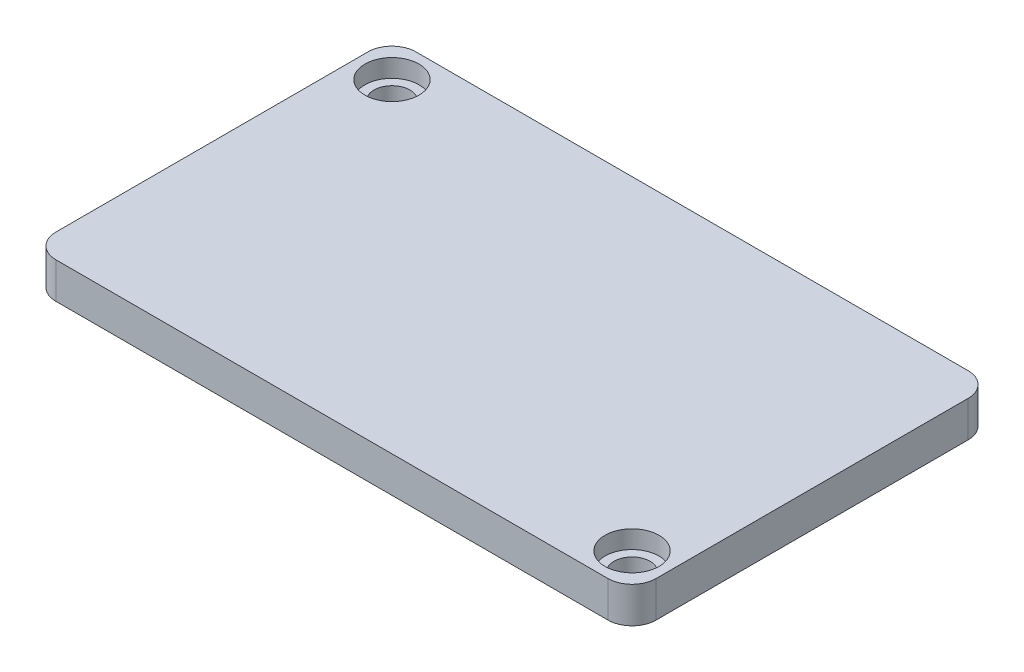
ISO-10303-21;
HEADER;
FILE_DESCRIPTION(('STEP AP214'),'2;1');
FILE_NAME('part.step','',(''),(''),'','','');
FILE_SCHEMA(('AUTOMOTIVE_DESIGN { 1 0 10303 214 1 1 1 1 }'));
ENDSEC;
DATA;
#1=APPLICATION_CONTEXT('core data for automotive mechanical design processes');
#2=APPLICATION_PROTOCOL_DEFINITION('international standard','automotive_design',2000,#1);
#3=PRODUCT_CONTEXT('',#1,'mechanical');
#4=PRODUCT('Part','Part','',(#3));
#5=PRODUCT_RELATED_PRODUCT_CATEGORY('part','',(#4));
#6=PRODUCT_DEFINITION_FORMATION('','',#4);
#7=PRODUCT_DEFINITION_CONTEXT('part definition',#1,'design');
#8=PRODUCT_DEFINITION('design','',#6,#7);
#9=PRODUCT_DEFINITION_SHAPE('','',#8);
#10=(LENGTH_UNIT() NAMED_UNIT(*) SI_UNIT(.MILLI.,.METRE.));
#11=(NAMED_UNIT(*) PLANE_ANGLE_UNIT() SI_UNIT($,.RADIAN.));
#12=(NAMED_UNIT(*) SI_UNIT($,.STERADIAN.) SOLID_ANGLE_UNIT());
#13=UNCERTAINTY_MEASURE_WITH_UNIT(LENGTH_MEASURE(1.E-05),#10,'distance_accuracy_value','');
#14=(GEOMETRIC_REPRESENTATION_CONTEXT(3) GLOBAL_UNCERTAINTY_ASSIGNED_CONTEXT((#13)) GLOBAL_UNIT_ASSIGNED_CONTEXT((#10,
#11,#12)) REPRESENTATION_CONTEXT('',''));
#15=CARTESIAN_POINT('',(0.,0.,0.));
#16=DIRECTION('',(0.,0.,1.));
#17=DIRECTION('',(1.,0.,0.));
#18=AXIS2_PLACEMENT_3D('',#15,#16,#17);
#19=CARTESIAN_POINT('',(22.,7.,12.));
#20=DIRECTION('',(0.,-1.,0.));
#21=DIRECTION('',(0.,0.,-1.));
#22=AXIS2_PLACEMENT_3D('',#19,#20,#21);
#23=CYLINDRICAL_SURFACE('',#22,1.5);
#24=CARTESIAN_POINT('',(22.,0.,12.));
#25=DIRECTION('',(0.,-1.,0.));
#26=DIRECTION('',(0.,0.,-1.));
#27=AXIS2_PLACEMENT_3D('',#24,#25,#26);
#28=CIRCLE('',#27,1.5);
#29=CARTESIAN_POINT('',(22.,0.,10.5));
#30=VERTEX_POINT('',#29);
#31=EDGE_CURVE('E203',#30,#30,#28,.T.);
#32=ORIENTED_EDGE('',*,*,#31,.T.);
#33=EDGE_LOOP('',(#32));
#34=FACE_BOUND('',#33,.T.);
#35=CARTESIAN_POINT('',(22.,1.5,12.));
#36=DIRECTION('',(0.,1.,0.));
#37=DIRECTION('',(0.,0.,1.));
#38=AXIS2_PLACEMENT_3D('',#35,#36,#37);
#39=CIRCLE('',#38,1.5);
#40=CARTESIAN_POINT('',(22.,1.5,13.5));
#41=VERTEX_POINT('',#40);
#42=EDGE_CURVE('E48',#41,#41,#39,.F.);
#43=ORIENTED_EDGE('',*,*,#42,.F.);
#44=EDGE_LOOP('',(#43));
#45=FACE_BOUND('',#44,.T.);
#46=ADVANCED_FACE('F44',(#34,#45),#23,.F.);
#47=CARTESIAN_POINT('',(-22.,7.,-12.));
#48=DIRECTION('',(0.,-1.,0.));
#49=DIRECTION('',(0.,0.,-1.));
#50=AXIS2_PLACEMENT_3D('',#47,#48,#49);
#51=CYLINDRICAL_SURFACE('',#50,1.5);
#52=CARTESIAN_POINT('',(-22.,0.,-12.));
#53=DIRECTION('',(0.,-1.,0.));
#54=DIRECTION('',(0.,0.,-1.));
#55=AXIS2_PLACEMENT_3D('',#52,#53,#54);
#56=CIRCLE('',#55,1.5);
#57=CARTESIAN_POINT('',(-22.,0.,-13.5));
#58=VERTEX_POINT('',#57);
#59=EDGE_CURVE('E231',#58,#58,#56,.T.);
#60=ORIENTED_EDGE('',*,*,#59,.T.);
#61=EDGE_LOOP('',(#60));
#62=FACE_BOUND('',#61,.T.);
#63=CARTESIAN_POINT('',(-22.,1.5,-12.));
#64=DIRECTION('',(0.,1.,0.));
#65=DIRECTION('',(0.,0.,1.));
#66=AXIS2_PLACEMENT_3D('',#63,#64,#65);
#67=CIRCLE('',#66,1.5);
#68=CARTESIAN_POINT('',(-22.,1.5,-10.5));
#69=VERTEX_POINT('',#68);
#70=EDGE_CURVE('E370',#69,#69,#67,.F.);
#71=ORIENTED_EDGE('',*,*,#70,.F.);
#72=EDGE_LOOP('',(#71));
#73=FACE_BOUND('',#72,.T.);
#74=ADVANCED_FACE('F409',(#62,#73),#51,.F.);
#75=CARTESIAN_POINT('',(0.,0.,0.));
#76=DIRECTION('',(0.,-1.,0.));
#77=DIRECTION('',(0.,0.,-1.));
#78=AXIS2_PLACEMENT_3D('',#75,#76,#77);
#79=PLANE('',#78);
#80=ORIENTED_EDGE('',*,*,#59,.F.);
#81=EDGE_LOOP('',(#80));
#82=FACE_BOUND('',#81,.T.);
#83=ORIENTED_EDGE('',*,*,#31,.F.);
#84=EDGE_LOOP('',(#83));
#85=FACE_BOUND('',#84,.T.);
#86=DIRECTION('',(0.,0.,-1.));
#87=VECTOR('',#86,1.);
#88=CARTESIAN_POINT('',(25.,0.,15.));
#89=LINE('',#88,#87);
#90=CARTESIAN_POINT('',(25.,0.,13.));
#91=VERTEX_POINT('',#90);
#92=CARTESIAN_POINT('',(25.,0.,-13.));
#93=VERTEX_POINT('',#92);
#94=EDGE_CURVE('E184',#91,#93,#89,.T.);
#95=ORIENTED_EDGE('',*,*,#94,.F.);
#96=CARTESIAN_POINT('',(23.,0.,13.));
#97=DIRECTION('',(0.,-1.,0.));
#98=DIRECTION('',(0.,0.,-1.));
#99=AXIS2_PLACEMENT_3D('',#96,#97,#98);
#100=CIRCLE('',#99,2.);
#101=CARTESIAN_POINT('',(23.,0.,15.));
#102=VERTEX_POINT('',#101);
#103=EDGE_CURVE('E315',#91,#102,#100,.T.);
#104=ORIENTED_EDGE('',*,*,#103,.T.);
#105=DIRECTION('',(1.,0.,0.));
#106=VECTOR('',#105,1.);
#107=CARTESIAN_POINT('',(-25.,0.,15.));
#108=LINE('',#107,#106);
#109=CARTESIAN_POINT('',(-23.,0.,15.));
#110=VERTEX_POINT('',#109);
#111=EDGE_CURVE('E273',#110,#102,#108,.T.);
#112=ORIENTED_EDGE('',*,*,#111,.F.);
#113=CARTESIAN_POINT('',(-23.,0.,13.));
#114=DIRECTION('',(0.,-1.,0.));
#115=DIRECTION('',(0.,0.,-1.));
#116=AXIS2_PLACEMENT_3D('',#113,#114,#115);
#117=CIRCLE('',#116,2.);
#118=CARTESIAN_POINT('',(-25.,0.,13.));
#119=VERTEX_POINT('',#118);
#120=EDGE_CURVE('E309',#110,#119,#117,.T.);
#121=ORIENTED_EDGE('',*,*,#120,.T.);
#122=DIRECTION('',(0.,0.,1.));
#123=VECTOR('',#122,1.);
#124=CARTESIAN_POINT('',(-25.,0.,15.));
#125=LINE('',#124,#123);
#126=CARTESIAN_POINT('',(-25.,0.,-13.));
#127=VERTEX_POINT('',#126);
#128=EDGE_CURVE('E293',#127,#119,#125,.T.);
#129=ORIENTED_EDGE('',*,*,#128,.F.);
#130=CARTESIAN_POINT('',(-23.,0.,-13.));
#131=DIRECTION('',(0.,-1.,0.));
#132=DIRECTION('',(0.,0.,-1.));
#133=AXIS2_PLACEMENT_3D('',#130,#131,#132);
#134=CIRCLE('',#133,2.);
#135=CARTESIAN_POINT('',(-23.,0.,-15.));
#136=VERTEX_POINT('',#135);
#137=EDGE_CURVE('E312',#127,#136,#134,.T.);
#138=ORIENTED_EDGE('',*,*,#137,.T.);
#139=DIRECTION('',(-1.,0.,0.));
#140=VECTOR('',#139,1.);
#141=CARTESIAN_POINT('',(-25.,0.,-15.));
#142=LINE('',#141,#140);
#143=CARTESIAN_POINT('',(23.,0.,-15.));
#144=VERTEX_POINT('',#143);
#145=EDGE_CURVE('E289',#144,#136,#142,.T.);
#146=ORIENTED_EDGE('',*,*,#145,.F.);
#147=CARTESIAN_POINT('',(23.,0.,-13.));
#148=DIRECTION('',(0.,-1.,0.));
#149=DIRECTION('',(0.,0.,-1.));
#150=AXIS2_PLACEMENT_3D('',#147,#148,#149);
#151=CIRCLE('',#150,2.);
#152=EDGE_CURVE('E306',#144,#93,#151,.T.);
#153=ORIENTED_EDGE('',*,*,#152,.T.);
#154=EDGE_LOOP('',(#95,#104,#112,#121,#129,#138,#146,#153));
#155=FACE_BOUND('',#154,.T.);
#156=DIRECTION('',(0.,0.,-1.));
#157=VECTOR('',#156,1.);
#158=CARTESIAN_POINT('',(19.,0.,0.));
#159=LINE('',#158,#157);
#160=CARTESIAN_POINT('',(19.,0.,12.));
#161=VERTEX_POINT('',#160);
#162=CARTESIAN_POINT('',(19.,0.,11.));
#163=VERTEX_POINT('',#162);
#164=EDGE_CURVE('E242',#161,#163,#159,.T.);
#165=ORIENTED_EDGE('',*,*,#164,.T.);
#166=CARTESIAN_POINT('',(21.,0.,11.));
#167=DIRECTION('',(0.,-1.,0.));
#168=DIRECTION('',(0.,0.,-1.));
#169=AXIS2_PLACEMENT_3D('',#166,#167,#168);
#170=CIRCLE('',#169,2.);
#171=CARTESIAN_POINT('',(21.,0.,9.));
#172=VERTEX_POINT('',#171);
#173=EDGE_CURVE('E358',#163,#172,#170,.T.);
#174=ORIENTED_EDGE('',*,*,#173,.T.);
#175=DIRECTION('',(-1.,0.,0.));
#176=VECTOR('',#175,1.);
#177=CARTESIAN_POINT('',(0.,0.,9.));
#178=LINE('',#177,#176);
#179=CARTESIAN_POINT('',(22.,0.,9.));
#180=VERTEX_POINT('',#179);
#181=EDGE_CURVE('E238',#180,#172,#178,.T.);
#182=ORIENTED_EDGE('',*,*,#181,.F.);
#183=DIRECTION('',(0.,0.,1.));
#184=VECTOR('',#183,1.);
#185=CARTESIAN_POINT('',(22.,0.,0.));
#186=LINE('',#185,#184);
#187=CARTESIAN_POINT('',(22.,0.,-12.));
#188=VERTEX_POINT('',#187);
#189=EDGE_CURVE('E234',#188,#180,#186,.T.);
#190=ORIENTED_EDGE('',*,*,#189,.F.);
#191=DIRECTION('',(1.,0.,0.));
#192=VECTOR('',#191,1.);
#193=CARTESIAN_POINT('',(0.,0.,-12.));
#194=LINE('',#193,#192);
#195=CARTESIAN_POINT('',(-19.,0.,-12.));
#196=VERTEX_POINT('',#195);
#197=EDGE_CURVE('E230',#196,#188,#194,.T.);
#198=ORIENTED_EDGE('',*,*,#197,.F.);
#199=DIRECTION('',(0.,0.,1.));
#200=VECTOR('',#199,1.);
#201=CARTESIAN_POINT('',(-19.,0.,0.));
#202=LINE('',#201,#200);
#203=CARTESIAN_POINT('',(-19.,0.,-11.));
#204=VERTEX_POINT('',#203);
#205=EDGE_CURVE('E180',#196,#204,#202,.T.);
#206=ORIENTED_EDGE('',*,*,#205,.T.);
#207=CARTESIAN_POINT('',(-21.,0.,-11.));
#208=DIRECTION('',(0.,-1.,0.));
#209=DIRECTION('',(0.,0.,-1.));
#210=AXIS2_PLACEMENT_3D('',#207,#208,#209);
#211=CIRCLE('',#210,2.);
#212=CARTESIAN_POINT('',(-21.,0.,-9.));
#213=VERTEX_POINT('',#212);
#214=EDGE_CURVE('E355',#204,#213,#211,.T.);
#215=ORIENTED_EDGE('',*,*,#214,.T.);
#216=DIRECTION('',(1.,0.,0.));
#217=VECTOR('',#216,1.);
#218=CARTESIAN_POINT('',(0.,0.,-9.));
#219=LINE('',#218,#217);
#220=CARTESIAN_POINT('',(-22.,0.,-9.));
#221=VERTEX_POINT('',#220);
#222=EDGE_CURVE('E197',#221,#213,#219,.T.);
#223=ORIENTED_EDGE('',*,*,#222,.F.);
#224=DIRECTION('',(0.,0.,1.));
#225=VECTOR('',#224,1.);
#226=CARTESIAN_POINT('',(-22.,0.,0.));
#227=LINE('',#226,#225);
#228=CARTESIAN_POINT('',(-22.,0.,12.));
#229=VERTEX_POINT('',#228);
#230=EDGE_CURVE('E200',#221,#229,#227,.T.);
#231=ORIENTED_EDGE('',*,*,#230,.T.);
#232=DIRECTION('',(1.,0.,0.));
#233=VECTOR('',#232,1.);
#234=CARTESIAN_POINT('',(0.,0.,12.));
#235=LINE('',#234,#233);
#236=EDGE_CURVE('E246',#229,#161,#235,.T.);
#237=ORIENTED_EDGE('',*,*,#236,.T.);
#238=EDGE_LOOP('',(#165,#174,#182,#190,#198,#206,#215,#223,#231,#237));
#239=FACE_BOUND('',#238,.T.);
#240=ADVANCED_FACE('F405',(#82,#85,#155,#239),#79,.T.);
#241=CARTESIAN_POINT('',(25.,3.,15.));
#242=DIRECTION('',(-1.,0.,0.));
#243=DIRECTION('',(0.,0.,1.));
#244=AXIS2_PLACEMENT_3D('',#241,#242,#243);
#245=PLANE('',#244);
#246=DIRECTION('',(0.,0.,-1.));
#247=VECTOR('',#246,1.);
#248=CARTESIAN_POINT('',(25.,3.,15.));
#249=LINE('',#248,#247);
#250=CARTESIAN_POINT('',(25.,3.,13.));
#251=VERTEX_POINT('',#250);
#252=CARTESIAN_POINT('',(25.,3.,-13.));
#253=VERTEX_POINT('',#252);
#254=EDGE_CURVE('E268',#251,#253,#249,.T.);
#255=ORIENTED_EDGE('',*,*,#254,.F.);
#256=DIRECTION('',(0.,-1.,0.));
#257=VECTOR('',#256,1.);
#258=CARTESIAN_POINT('',(25.,3.,13.));
#259=LINE('',#258,#257);
#260=EDGE_CURVE('E302',#251,#91,#259,.T.);
#261=ORIENTED_EDGE('',*,*,#260,.T.);
#262=ORIENTED_EDGE('',*,*,#94,.T.);
#263=DIRECTION('',(0.,-1.,0.));
#264=VECTOR('',#263,1.);
#265=CARTESIAN_POINT('',(25.,3.,-13.));
#266=LINE('',#265,#264);
#267=EDGE_CURVE('E285',#93,#253,#266,.F.);
#268=ORIENTED_EDGE('',*,*,#267,.T.);
#269=EDGE_LOOP('',(#255,#261,#262,#268));
#270=FACE_BOUND('',#269,.T.);
#271=ADVANCED_FACE('F408',(#270),#245,.F.);
#272=CARTESIAN_POINT('',(-25.,3.,-15.));
#273=DIRECTION('',(0.,0.,1.));
#274=DIRECTION('',(1.,0.,0.));
#275=AXIS2_PLACEMENT_3D('',#272,#273,#274);
#276=PLANE('',#275);
#277=ORIENTED_EDGE('',*,*,#145,.T.);
#278=DIRECTION('',(0.,-1.,0.));
#279=VECTOR('',#278,1.);
#280=CARTESIAN_POINT('',(-23.,3.,-15.));
#281=LINE('',#280,#279);
#282=CARTESIAN_POINT('',(-23.,3.,-15.));
#283=VERTEX_POINT('',#282);
#284=EDGE_CURVE('E348',#136,#283,#281,.F.);
#285=ORIENTED_EDGE('',*,*,#284,.T.);
#286=DIRECTION('',(-1.,0.,0.));
#287=VECTOR('',#286,1.);
#288=CARTESIAN_POINT('',(-25.,3.,-15.));
#289=LINE('',#288,#287);
#290=CARTESIAN_POINT('',(23.,3.,-15.));
#291=VERTEX_POINT('',#290);
#292=EDGE_CURVE('E272',#291,#283,#289,.T.);
#293=ORIENTED_EDGE('',*,*,#292,.F.);
#294=DIRECTION('',(0.,-1.,0.));
#295=VECTOR('',#294,1.);
#296=CARTESIAN_POINT('',(23.,3.,-15.));
#297=LINE('',#296,#295);
#298=EDGE_CURVE('E344',#291,#144,#297,.T.);
#299=ORIENTED_EDGE('',*,*,#298,.T.);
#300=EDGE_LOOP('',(#277,#285,#293,#299));
#301=FACE_BOUND('',#300,.T.);
#302=ADVANCED_FACE('F484',(#301),#276,.F.);
#303=CARTESIAN_POINT('',(-25.,3.,15.));
#304=DIRECTION('',(1.,0.,0.));
#305=DIRECTION('',(0.,0.,-1.));
#306=AXIS2_PLACEMENT_3D('',#303,#304,#305);
#307=PLANE('',#306);
#308=DIRECTION('',(0.,0.,1.));
#309=VECTOR('',#308,1.);
#310=CARTESIAN_POINT('',(-25.,3.,15.));
#311=LINE('',#310,#309);
#312=CARTESIAN_POINT('',(-25.,3.,-13.));
#313=VERTEX_POINT('',#312);
#314=CARTESIAN_POINT('',(-25.,3.,13.));
#315=VERTEX_POINT('',#314);
#316=EDGE_CURVE('E277',#313,#315,#311,.T.);
#317=ORIENTED_EDGE('',*,*,#316,.F.);
#318=DIRECTION('',(0.,-1.,0.));
#319=VECTOR('',#318,1.);
#320=CARTESIAN_POINT('',(-25.,3.,-13.));
#321=LINE('',#320,#319);
#322=EDGE_CURVE('E340',#313,#127,#321,.T.);
#323=ORIENTED_EDGE('',*,*,#322,.T.);
#324=ORIENTED_EDGE('',*,*,#128,.T.);
#325=DIRECTION('',(0.,-1.,0.));
#326=VECTOR('',#325,1.);
#327=CARTESIAN_POINT('',(-25.,3.,13.));
#328=LINE('',#327,#326);
#329=EDGE_CURVE('E337',#119,#315,#328,.F.);
#330=ORIENTED_EDGE('',*,*,#329,.T.);
#331=EDGE_LOOP('',(#317,#323,#324,#330));
#332=FACE_BOUND('',#331,.T.);
#333=ADVANCED_FACE('F480',(#332),#307,.F.);
#334=CARTESIAN_POINT('',(-25.,3.,15.));
#335=DIRECTION('',(0.,0.,-1.));
#336=DIRECTION('',(-1.,0.,0.));
#337=AXIS2_PLACEMENT_3D('',#334,#335,#336);
#338=PLANE('',#337);
#339=ORIENTED_EDGE('',*,*,#111,.T.);
#340=DIRECTION('',(0.,-1.,0.));
#341=VECTOR('',#340,1.);
#342=CARTESIAN_POINT('',(23.,3.,15.));
#343=LINE('',#342,#341);
#344=CARTESIAN_POINT('',(23.,3.,15.));
#345=VERTEX_POINT('',#344);
#346=EDGE_CURVE('E322',#102,#345,#343,.F.);
#347=ORIENTED_EDGE('',*,*,#346,.T.);
#348=DIRECTION('',(1.,0.,0.));
#349=VECTOR('',#348,1.);
#350=CARTESIAN_POINT('',(-25.,3.,15.));
#351=LINE('',#350,#349);
#352=CARTESIAN_POINT('',(-23.,3.,15.));
#353=VERTEX_POINT('',#352);
#354=EDGE_CURVE('E281',#353,#345,#351,.T.);
#355=ORIENTED_EDGE('',*,*,#354,.F.);
#356=DIRECTION('',(0.,-1.,0.));
#357=VECTOR('',#356,1.);
#358=CARTESIAN_POINT('',(-23.,3.,15.));
#359=LINE('',#358,#357);
#360=EDGE_CURVE('E318',#353,#110,#359,.T.);
#361=ORIENTED_EDGE('',*,*,#360,.T.);
#362=EDGE_LOOP('',(#339,#347,#355,#361));
#363=FACE_BOUND('',#362,.T.);
#364=ADVANCED_FACE('F475',(#363),#338,.F.);
#365=CARTESIAN_POINT('',(0.,3.,0.));
#366=DIRECTION('',(0.,-1.,0.));
#367=DIRECTION('',(0.,0.,-1.));
#368=AXIS2_PLACEMENT_3D('',#365,#366,#367);
#369=PLANE('',#368);
#370=CARTESIAN_POINT('',(-22.,3.,-12.));
#371=DIRECTION('',(0.,1.,0.));
#372=DIRECTION('',(0.,0.,1.));
#373=AXIS2_PLACEMENT_3D('',#370,#371,#372);
#374=CIRCLE('',#373,2.25);
#375=CARTESIAN_POINT('',(-22.,3.,-9.75));
#376=VERTEX_POINT('',#375);
#377=EDGE_CURVE('E380',#376,#376,#374,.T.);
#378=ORIENTED_EDGE('',*,*,#377,.F.);
#379=EDGE_LOOP('',(#378));
#380=FACE_BOUND('',#379,.T.);
#381=CARTESIAN_POINT('',(22.,3.,12.));
#382=DIRECTION('',(0.,1.,0.));
#383=DIRECTION('',(0.,0.,1.));
#384=AXIS2_PLACEMENT_3D('',#381,#382,#383);
#385=CIRCLE('',#384,2.25);
#386=CARTESIAN_POINT('',(22.,3.,14.25));
#387=VERTEX_POINT('',#386);
#388=EDGE_CURVE('E386',#387,#387,#385,.T.);
#389=ORIENTED_EDGE('',*,*,#388,.F.);
#390=EDGE_LOOP('',(#389));
#391=FACE_BOUND('',#390,.T.);
#392=ORIENTED_EDGE('',*,*,#354,.T.);
#393=CARTESIAN_POINT('',(23.,3.,13.));
#394=DIRECTION('',(0.,-1.,0.));
#395=DIRECTION('',(0.,0.,-1.));
#396=AXIS2_PLACEMENT_3D('',#393,#394,#395);
#397=CIRCLE('',#396,2.);
#398=EDGE_CURVE('E334',#345,#251,#397,.F.);
#399=ORIENTED_EDGE('',*,*,#398,.T.);
#400=ORIENTED_EDGE('',*,*,#254,.T.);
#401=CARTESIAN_POINT('',(23.,3.,-13.));
#402=DIRECTION('',(0.,-1.,0.));
#403=DIRECTION('',(0.,0.,-1.));
#404=AXIS2_PLACEMENT_3D('',#401,#402,#403);
#405=CIRCLE('',#404,2.);
#406=EDGE_CURVE('E325',#253,#291,#405,.F.);
#407=ORIENTED_EDGE('',*,*,#406,.T.);
#408=ORIENTED_EDGE('',*,*,#292,.T.);
#409=CARTESIAN_POINT('',(-23.,3.,-13.));
#410=DIRECTION('',(0.,-1.,0.));
#411=DIRECTION('',(0.,0.,-1.));
#412=AXIS2_PLACEMENT_3D('',#409,#410,#411);
#413=CIRCLE('',#412,2.);
#414=EDGE_CURVE('E331',#283,#313,#413,.F.);
#415=ORIENTED_EDGE('',*,*,#414,.T.);
#416=ORIENTED_EDGE('',*,*,#316,.T.);
#417=CARTESIAN_POINT('',(-23.,3.,13.));
#418=DIRECTION('',(0.,-1.,0.));
#419=DIRECTION('',(0.,0.,-1.));
#420=AXIS2_PLACEMENT_3D('',#417,#418,#419);
#421=CIRCLE('',#420,2.);
#422=EDGE_CURVE('E328',#315,#353,#421,.F.);
#423=ORIENTED_EDGE('',*,*,#422,.T.);
#424=EDGE_LOOP('',(#392,#399,#400,#407,#408,#415,#416,#423));
#425=FACE_BOUND('',#424,.T.);
#426=ADVANCED_FACE('F473',(#380,#391,#425),#369,.F.);
#427=CARTESIAN_POINT('',(-19.,-2.,0.));
#428=DIRECTION('',(-1.,0.,0.));
#429=DIRECTION('',(0.,0.,1.));
#430=AXIS2_PLACEMENT_3D('',#427,#428,#429);
#431=PLANE('',#430);
#432=DIRECTION('',(0.,0.,1.));
#433=VECTOR('',#432,1.);
#434=CARTESIAN_POINT('',(-19.,-2.,0.));
#435=LINE('',#434,#433);
#436=CARTESIAN_POINT('',(-19.,-2.,-12.));
#437=VERTEX_POINT('',#436);
#438=CARTESIAN_POINT('',(-19.,-2.,-11.));
#439=VERTEX_POINT('',#438);
#440=EDGE_CURVE('E177',#437,#439,#435,.T.);
#441=ORIENTED_EDGE('',*,*,#440,.T.);
#442=DIRECTION('',(0.,1.,0.));
#443=VECTOR('',#442,1.);
#444=CARTESIAN_POINT('',(-19.,-2.,-11.));
#445=LINE('',#444,#443);
#446=EDGE_CURVE('E364',#439,#204,#445,.T.);
#447=ORIENTED_EDGE('',*,*,#446,.T.);
#448=ORIENTED_EDGE('',*,*,#205,.F.);
#449=DIRECTION('',(0.,1.,0.));
#450=VECTOR('',#449,1.);
#451=CARTESIAN_POINT('',(-19.,-2.,-12.));
#452=LINE('',#451,#450);
#453=EDGE_CURVE('E173',#437,#196,#452,.T.);
#454=ORIENTED_EDGE('',*,*,#453,.F.);
#455=EDGE_LOOP('',(#441,#447,#448,#454));
#456=FACE_BOUND('',#455,.T.);
#457=ADVANCED_FACE('F175',(#456),#431,.T.);
#458=CARTESIAN_POINT('',(0.,-2.,-12.));
#459=DIRECTION('',(0.,0.,1.));
#460=DIRECTION('',(1.,0.,0.));
#461=AXIS2_PLACEMENT_3D('',#458,#459,#460);
#462=PLANE('',#461);
#463=ORIENTED_EDGE('',*,*,#197,.T.);
#464=DIRECTION('',(0.,1.,0.));
#465=VECTOR('',#464,1.);
#466=CARTESIAN_POINT('',(22.,-2.,-12.));
#467=LINE('',#466,#465);
#468=CARTESIAN_POINT('',(22.,-2.,-12.));
#469=VERTEX_POINT('',#468);
#470=EDGE_CURVE('E185',#469,#188,#467,.T.);
#471=ORIENTED_EDGE('',*,*,#470,.F.);
#472=DIRECTION('',(1.,0.,0.));
#473=VECTOR('',#472,1.);
#474=CARTESIAN_POINT('',(0.,-2.,-12.));
#475=LINE('',#474,#473);
#476=EDGE_CURVE('E188',#437,#469,#475,.T.);
#477=ORIENTED_EDGE('',*,*,#476,.F.);
#478=ORIENTED_EDGE('',*,*,#453,.T.);
#479=EDGE_LOOP('',(#463,#471,#477,#478));
#480=FACE_BOUND('',#479,.T.);
#481=ADVANCED_FACE('F189',(#480),#462,.F.);
#482=CARTESIAN_POINT('',(22.,-2.,0.));
#483=DIRECTION('',(-1.,0.,0.));
#484=DIRECTION('',(0.,0.,1.));
#485=AXIS2_PLACEMENT_3D('',#482,#483,#484);
#486=PLANE('',#485);
#487=ORIENTED_EDGE('',*,*,#189,.T.);
#488=DIRECTION('',(0.,1.,0.));
#489=VECTOR('',#488,1.);
#490=CARTESIAN_POINT('',(22.,-2.,9.));
#491=LINE('',#490,#489);
#492=CARTESIAN_POINT('',(22.,-2.,9.));
#493=VERTEX_POINT('',#492);
#494=EDGE_CURVE('E262',#493,#180,#491,.T.);
#495=ORIENTED_EDGE('',*,*,#494,.F.);
#496=DIRECTION('',(0.,0.,1.));
#497=VECTOR('',#496,1.);
#498=CARTESIAN_POINT('',(22.,-2.,0.));
#499=LINE('',#498,#497);
#500=EDGE_CURVE('E193',#469,#493,#499,.T.);
#501=ORIENTED_EDGE('',*,*,#500,.F.);
#502=ORIENTED_EDGE('',*,*,#470,.T.);
#503=EDGE_LOOP('',(#487,#495,#501,#502));
#504=FACE_BOUND('',#503,.T.);
#505=ADVANCED_FACE('F429',(#504),#486,.F.);
#506=CARTESIAN_POINT('',(0.,-2.,9.));
#507=DIRECTION('',(0.,0.,-1.));
#508=DIRECTION('',(-1.,0.,0.));
#509=AXIS2_PLACEMENT_3D('',#506,#507,#508);
#510=PLANE('',#509);
#511=ORIENTED_EDGE('',*,*,#181,.T.);
#512=DIRECTION('',(0.,1.,0.));
#513=VECTOR('',#512,1.);
#514=CARTESIAN_POINT('',(21.,-2.,9.));
#515=LINE('',#514,#513);
#516=CARTESIAN_POINT('',(21.,-2.,9.));
#517=VERTEX_POINT('',#516);
#518=EDGE_CURVE('E361',#172,#517,#515,.F.);
#519=ORIENTED_EDGE('',*,*,#518,.T.);
#520=DIRECTION('',(-1.,0.,0.));
#521=VECTOR('',#520,1.);
#522=CARTESIAN_POINT('',(0.,-2.,9.));
#523=LINE('',#522,#521);
#524=EDGE_CURVE('E208',#493,#517,#523,.T.);
#525=ORIENTED_EDGE('',*,*,#524,.F.);
#526=ORIENTED_EDGE('',*,*,#494,.T.);
#527=EDGE_LOOP('',(#511,#519,#525,#526));
#528=FACE_BOUND('',#527,.T.);
#529=ADVANCED_FACE('F426',(#528),#510,.F.);
#530=CARTESIAN_POINT('',(19.,-2.,0.));
#531=DIRECTION('',(1.,0.,0.));
#532=DIRECTION('',(0.,0.,-1.));
#533=AXIS2_PLACEMENT_3D('',#530,#531,#532);
#534=PLANE('',#533);
#535=DIRECTION('',(0.,0.,-1.));
#536=VECTOR('',#535,1.);
#537=CARTESIAN_POINT('',(19.,-2.,0.));
#538=LINE('',#537,#536);
#539=CARTESIAN_POINT('',(19.,-2.,12.));
#540=VERTEX_POINT('',#539);
#541=CARTESIAN_POINT('',(19.,-2.,11.));
#542=VERTEX_POINT('',#541);
#543=EDGE_CURVE('E212',#540,#542,#538,.T.);
#544=ORIENTED_EDGE('',*,*,#543,.T.);
#545=DIRECTION('',(0.,1.,0.));
#546=VECTOR('',#545,1.);
#547=CARTESIAN_POINT('',(19.,-2.,11.));
#548=LINE('',#547,#546);
#549=EDGE_CURVE('E351',#542,#163,#548,.T.);
#550=ORIENTED_EDGE('',*,*,#549,.T.);
#551=ORIENTED_EDGE('',*,*,#164,.F.);
#552=DIRECTION('',(0.,1.,0.));
#553=VECTOR('',#552,1.);
#554=CARTESIAN_POINT('',(19.,-2.,12.));
#555=LINE('',#554,#553);
#556=EDGE_CURVE('E258',#540,#161,#555,.T.);
#557=ORIENTED_EDGE('',*,*,#556,.F.);
#558=EDGE_LOOP('',(#544,#550,#551,#557));
#559=FACE_BOUND('',#558,.T.);
#560=ADVANCED_FACE('F417',(#559),#534,.T.);
#561=CARTESIAN_POINT('',(0.,-2.,12.));
#562=DIRECTION('',(0.,0.,1.));
#563=DIRECTION('',(1.,0.,0.));
#564=AXIS2_PLACEMENT_3D('',#561,#562,#563);
#565=PLANE('',#564);
#566=ORIENTED_EDGE('',*,*,#236,.F.);
#567=DIRECTION('',(0.,1.,0.));
#568=VECTOR('',#567,1.);
#569=CARTESIAN_POINT('',(-22.,-2.,12.));
#570=LINE('',#569,#568);
#571=CARTESIAN_POINT('',(-22.,-2.,12.));
#572=VERTEX_POINT('',#571);
#573=EDGE_CURVE('E254',#572,#229,#570,.T.);
#574=ORIENTED_EDGE('',*,*,#573,.F.);
#575=DIRECTION('',(1.,0.,0.));
#576=VECTOR('',#575,1.);
#577=CARTESIAN_POINT('',(0.,-2.,12.));
#578=LINE('',#577,#576);
#579=EDGE_CURVE('E216',#572,#540,#578,.T.);
#580=ORIENTED_EDGE('',*,*,#579,.T.);
#581=ORIENTED_EDGE('',*,*,#556,.T.);
#582=EDGE_LOOP('',(#566,#574,#580,#581));
#583=FACE_BOUND('',#582,.T.);
#584=ADVANCED_FACE('F458',(#583),#565,.T.);
#585=CARTESIAN_POINT('',(-22.,-2.,0.));
#586=DIRECTION('',(-1.,0.,0.));
#587=DIRECTION('',(0.,0.,1.));
#588=AXIS2_PLACEMENT_3D('',#585,#586,#587);
#589=PLANE('',#588);
#590=ORIENTED_EDGE('',*,*,#230,.F.);
#591=DIRECTION('',(0.,1.,0.));
#592=VECTOR('',#591,1.);
#593=CARTESIAN_POINT('',(-22.,-2.,-9.));
#594=LINE('',#593,#592);
#595=CARTESIAN_POINT('',(-22.,-2.,-9.));
#596=VERTEX_POINT('',#595);
#597=EDGE_CURVE('E227',#596,#221,#594,.T.);
#598=ORIENTED_EDGE('',*,*,#597,.F.);
#599=DIRECTION('',(0.,0.,1.));
#600=VECTOR('',#599,1.);
#601=CARTESIAN_POINT('',(-22.,-2.,0.));
#602=LINE('',#601,#600);
#603=EDGE_CURVE('E220',#596,#572,#602,.T.);
#604=ORIENTED_EDGE('',*,*,#603,.T.);
#605=ORIENTED_EDGE('',*,*,#573,.T.);
#606=EDGE_LOOP('',(#590,#598,#604,#605));
#607=FACE_BOUND('',#606,.T.);
#608=ADVANCED_FACE('F455',(#607),#589,.T.);
#609=CARTESIAN_POINT('',(0.,-2.,-9.));
#610=DIRECTION('',(0.,0.,1.));
#611=DIRECTION('',(1.,0.,0.));
#612=AXIS2_PLACEMENT_3D('',#609,#610,#611);
#613=PLANE('',#612);
#614=ORIENTED_EDGE('',*,*,#222,.T.);
#615=DIRECTION('',(0.,1.,0.));
#616=VECTOR('',#615,1.);
#617=CARTESIAN_POINT('',(-21.,-2.,-9.));
#618=LINE('',#617,#616);
#619=CARTESIAN_POINT('',(-21.,-2.,-9.));
#620=VERTEX_POINT('',#619);
#621=EDGE_CURVE('E62',#213,#620,#618,.F.);
#622=ORIENTED_EDGE('',*,*,#621,.T.);
#623=DIRECTION('',(1.,0.,0.));
#624=VECTOR('',#623,1.);
#625=CARTESIAN_POINT('',(0.,-2.,-9.));
#626=LINE('',#625,#624);
#627=EDGE_CURVE('E224',#596,#620,#626,.T.);
#628=ORIENTED_EDGE('',*,*,#627,.F.);
#629=ORIENTED_EDGE('',*,*,#597,.T.);
#630=EDGE_LOOP('',(#614,#622,#628,#629));
#631=FACE_BOUND('',#630,.T.);
#632=ADVANCED_FACE('F431',(#631),#613,.F.);
#633=CARTESIAN_POINT('',(0.,-2.,0.));
#634=DIRECTION('',(0.,-1.,0.));
#635=DIRECTION('',(0.,0.,-1.));
#636=AXIS2_PLACEMENT_3D('',#633,#634,#635);
#637=PLANE('',#636);
#638=ORIENTED_EDGE('',*,*,#440,.F.);
#639=ORIENTED_EDGE('',*,*,#476,.T.);
#640=ORIENTED_EDGE('',*,*,#500,.T.);
#641=ORIENTED_EDGE('',*,*,#524,.T.);
#642=CARTESIAN_POINT('',(21.,-2.,11.));
#643=DIRECTION('',(0.,-1.,0.));
#644=DIRECTION('',(0.,0.,-1.));
#645=AXIS2_PLACEMENT_3D('',#642,#643,#644);
#646=CIRCLE('',#645,2.);
#647=EDGE_CURVE('E54',#517,#542,#646,.F.);
#648=ORIENTED_EDGE('',*,*,#647,.T.);
#649=ORIENTED_EDGE('',*,*,#543,.F.);
#650=ORIENTED_EDGE('',*,*,#579,.F.);
#651=ORIENTED_EDGE('',*,*,#603,.F.);
#652=ORIENTED_EDGE('',*,*,#627,.T.);
#653=CARTESIAN_POINT('',(-21.,-2.,-11.));
#654=DIRECTION('',(0.,-1.,0.));
#655=DIRECTION('',(0.,0.,-1.));
#656=AXIS2_PLACEMENT_3D('',#653,#654,#655);
#657=CIRCLE('',#656,2.);
#658=EDGE_CURVE('E11',#620,#439,#657,.F.);
#659=ORIENTED_EDGE('',*,*,#658,.T.);
#660=EDGE_LOOP('',(#638,#639,#640,#641,#648,#649,#650,#651,#652,#659));
#661=FACE_BOUND('',#660,.T.);
#662=ADVANCED_FACE('F195',(#661),#637,.T.);
#663=CARTESIAN_POINT('',(23.,3.,13.));
#664=DIRECTION('',(0.,-1.,0.));
#665=DIRECTION('',(0.,0.,-1.));
#666=AXIS2_PLACEMENT_3D('',#663,#664,#665);
#667=CYLINDRICAL_SURFACE('',#666,2.);
#668=ORIENTED_EDGE('',*,*,#398,.F.);
#669=ORIENTED_EDGE('',*,*,#346,.F.);
#670=ORIENTED_EDGE('',*,*,#103,.F.);
#671=ORIENTED_EDGE('',*,*,#260,.F.);
#672=EDGE_LOOP('',(#668,#669,#670,#671));
#673=FACE_BOUND('',#672,.T.);
#674=ADVANCED_FACE('F452',(#673),#667,.T.);
#675=CARTESIAN_POINT('',(-23.,3.,-13.));
#676=DIRECTION('',(0.,-1.,0.));
#677=DIRECTION('',(0.,0.,-1.));
#678=AXIS2_PLACEMENT_3D('',#675,#676,#677);
#679=CYLINDRICAL_SURFACE('',#678,2.);
#680=ORIENTED_EDGE('',*,*,#414,.F.);
#681=ORIENTED_EDGE('',*,*,#284,.F.);
#682=ORIENTED_EDGE('',*,*,#137,.F.);
#683=ORIENTED_EDGE('',*,*,#322,.F.);
#684=EDGE_LOOP('',(#680,#681,#682,#683));
#685=FACE_BOUND('',#684,.T.);
#686=ADVANCED_FACE('F494',(#685),#679,.T.);
#687=CARTESIAN_POINT('',(-23.,3.,13.));
#688=DIRECTION('',(0.,-1.,0.));
#689=DIRECTION('',(0.,0.,-1.));
#690=AXIS2_PLACEMENT_3D('',#687,#688,#689);
#691=CYLINDRICAL_SURFACE('',#690,2.);
#692=ORIENTED_EDGE('',*,*,#422,.F.);
#693=ORIENTED_EDGE('',*,*,#329,.F.);
#694=ORIENTED_EDGE('',*,*,#120,.F.);
#695=ORIENTED_EDGE('',*,*,#360,.F.);
#696=EDGE_LOOP('',(#692,#693,#694,#695));
#697=FACE_BOUND('',#696,.T.);
#698=ADVANCED_FACE('F498',(#697),#691,.T.);
#699=CARTESIAN_POINT('',(23.,3.,-13.));
#700=DIRECTION('',(0.,-1.,0.));
#701=DIRECTION('',(0.,0.,-1.));
#702=AXIS2_PLACEMENT_3D('',#699,#700,#701);
#703=CYLINDRICAL_SURFACE('',#702,2.);
#704=ORIENTED_EDGE('',*,*,#406,.F.);
#705=ORIENTED_EDGE('',*,*,#267,.F.);
#706=ORIENTED_EDGE('',*,*,#152,.F.);
#707=ORIENTED_EDGE('',*,*,#298,.F.);
#708=EDGE_LOOP('',(#704,#705,#706,#707));
#709=FACE_BOUND('',#708,.T.);
#710=ADVANCED_FACE('F441',(#709),#703,.T.);
#711=CARTESIAN_POINT('',(21.,-2.,11.));
#712=DIRECTION('',(0.,1.,0.));
#713=DIRECTION('',(0.,0.,1.));
#714=AXIS2_PLACEMENT_3D('',#711,#712,#713);
#715=CYLINDRICAL_SURFACE('',#714,2.);
#716=ORIENTED_EDGE('',*,*,#647,.F.);
#717=ORIENTED_EDGE('',*,*,#518,.F.);
#718=ORIENTED_EDGE('',*,*,#173,.F.);
#719=ORIENTED_EDGE('',*,*,#549,.F.);
#720=EDGE_LOOP('',(#716,#717,#718,#719));
#721=FACE_BOUND('',#720,.T.);
#722=ADVANCED_FACE('F422',(#721),#715,.F.);
#723=CARTESIAN_POINT('',(-21.,-2.,-11.));
#724=DIRECTION('',(0.,1.,0.));
#725=DIRECTION('',(0.,0.,1.));
#726=AXIS2_PLACEMENT_3D('',#723,#724,#725);
#727=CYLINDRICAL_SURFACE('',#726,2.);
#728=ORIENTED_EDGE('',*,*,#658,.F.);
#729=ORIENTED_EDGE('',*,*,#621,.F.);
#730=ORIENTED_EDGE('',*,*,#214,.F.);
#731=ORIENTED_EDGE('',*,*,#446,.F.);
#732=EDGE_LOOP('',(#728,#729,#730,#731));
#733=FACE_BOUND('',#732,.T.);
#734=ADVANCED_FACE('F46',(#733),#727,.F.);
#735=CARTESIAN_POINT('',(-22.,1.5,-12.));
#736=DIRECTION('',(0.,1.,0.));
#737=DIRECTION('',(0.,0.,1.));
#738=AXIS2_PLACEMENT_3D('',#735,#736,#737);
#739=PLANE('',#738);
#740=CARTESIAN_POINT('',(-22.,1.5,-12.));
#741=DIRECTION('',(0.,1.,0.));
#742=DIRECTION('',(0.,0.,1.));
#743=AXIS2_PLACEMENT_3D('',#740,#741,#742);
#744=CIRCLE('',#743,2.25);
#745=CARTESIAN_POINT('',(-22.,1.5,-9.75));
#746=VERTEX_POINT('',#745);
#747=EDGE_CURVE('E373',#746,#746,#744,.T.);
#748=ORIENTED_EDGE('',*,*,#747,.T.);
#749=EDGE_LOOP('',(#748));
#750=FACE_BOUND('',#749,.T.);
#751=ORIENTED_EDGE('',*,*,#70,.T.);
#752=EDGE_LOOP('',(#751));
#753=FACE_BOUND('',#752,.T.);
#754=ADVANCED_FACE('F434',(#750,#753),#739,.T.);
#755=CARTESIAN_POINT('',(-22.,1.5,-12.));
#756=DIRECTION('',(0.,1.,0.));
#757=DIRECTION('',(0.,0.,1.));
#758=AXIS2_PLACEMENT_3D('',#755,#756,#757);
#759=CYLINDRICAL_SURFACE('',#758,2.25);
#760=ORIENTED_EDGE('',*,*,#747,.F.);
#761=EDGE_LOOP('',(#760));
#762=FACE_BOUND('',#761,.T.);
#763=ORIENTED_EDGE('',*,*,#377,.T.);
#764=EDGE_LOOP('',(#763));
#765=FACE_BOUND('',#764,.T.);
#766=ADVANCED_FACE('F439',(#762,#765),#759,.F.);
#767=CARTESIAN_POINT('',(22.,1.5,12.));
#768=DIRECTION('',(0.,1.,0.));
#769=DIRECTION('',(0.,0.,1.));
#770=AXIS2_PLACEMENT_3D('',#767,#768,#769);
#771=PLANE('',#770);
#772=CARTESIAN_POINT('',(22.,1.5,12.));
#773=DIRECTION('',(0.,1.,0.));
#774=DIRECTION('',(0.,0.,1.));
#775=AXIS2_PLACEMENT_3D('',#772,#773,#774);
#776=CIRCLE('',#775,2.25);
#777=CARTESIAN_POINT('',(22.,1.5,14.25));
#778=VERTEX_POINT('',#777);
#779=EDGE_CURVE('E392',#778,#778,#776,.T.);
#780=ORIENTED_EDGE('',*,*,#779,.T.);
#781=EDGE_LOOP('',(#780));
#782=FACE_BOUND('',#781,.T.);
#783=ORIENTED_EDGE('',*,*,#42,.T.);
#784=EDGE_LOOP('',(#783));
#785=FACE_BOUND('',#784,.T.);
#786=ADVANCED_FACE('F579',(#782,#785),#771,.T.);
#787=CARTESIAN_POINT('',(22.,1.5,12.));
#788=DIRECTION('',(0.,1.,0.));
#789=DIRECTION('',(0.,0.,1.));
#790=AXIS2_PLACEMENT_3D('',#787,#788,#789);
#791=CYLINDRICAL_SURFACE('',#790,2.25);
#792=ORIENTED_EDGE('',*,*,#779,.F.);
#793=EDGE_LOOP('',(#792));
#794=FACE_BOUND('',#793,.T.);
#795=ORIENTED_EDGE('',*,*,#388,.T.);
#796=EDGE_LOOP('',(#795));
#797=FACE_BOUND('',#796,.T.);
#798=ADVANCED_FACE('F590',(#794,#797),#791,.F.);
#799=CLOSED_SHELL('',(#46,#74,#240,#271,#302,#333,#364,#426,#457,#481,#505,#529,#560,#584,#608,
#632,#662,#674,#686,#698,#710,#722,#734,#754,#766,#786,#798));
#800=MANIFOLD_SOLID_BREP('B2',#799);
#801=ADVANCED_BREP_SHAPE_REPRESENTATION('',(#18,#800),#14);
#802=SHAPE_DEFINITION_REPRESENTATION(#9,#801);
ENDSEC;
END-ISO-10303-21;
